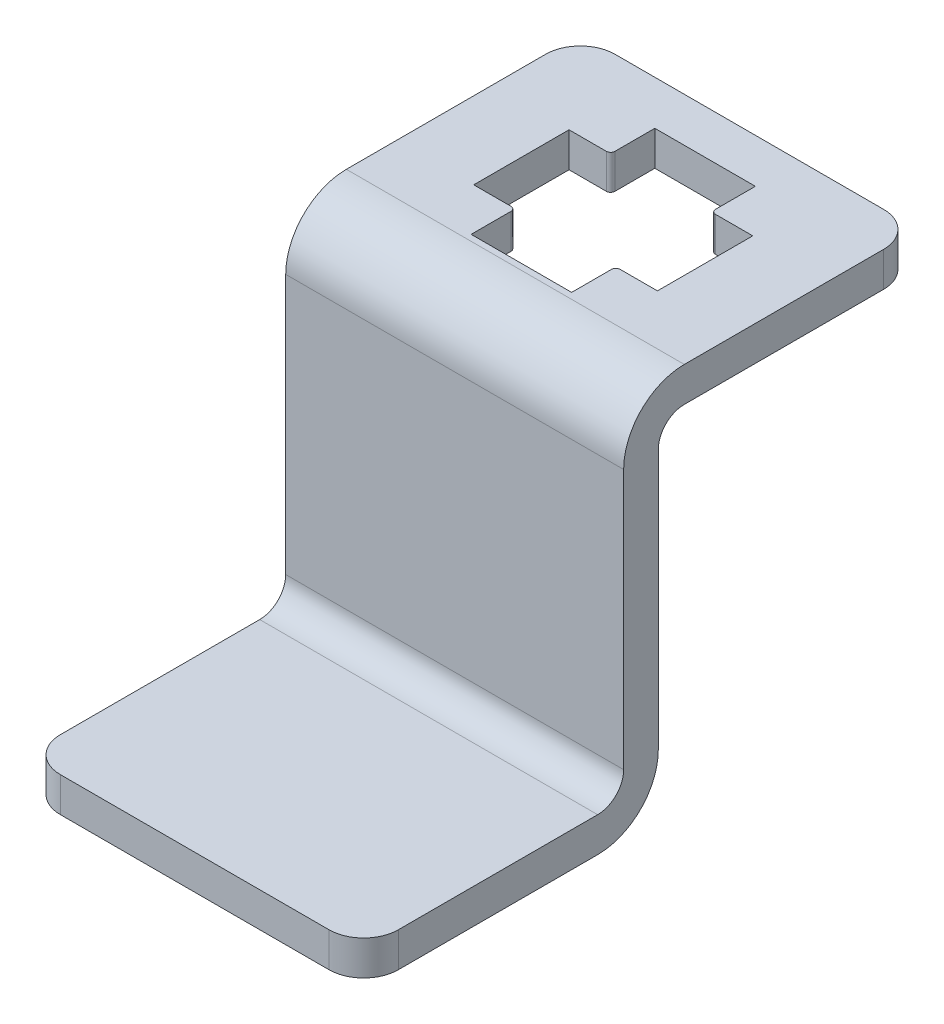
ISO-10303-21;
HEADER;
FILE_DESCRIPTION(('STEP AP214'),'2;1');
FILE_NAME('part.step','',(''),(''),'','','');
FILE_SCHEMA(('AUTOMOTIVE_DESIGN { 1 0 10303 214 1 1 1 1 }'));
ENDSEC;
DATA;
#1=APPLICATION_CONTEXT('core data for automotive mechanical design processes');
#2=APPLICATION_PROTOCOL_DEFINITION('international standard','automotive_design',2000,#1);
#3=PRODUCT_CONTEXT('',#1,'mechanical');
#4=PRODUCT('Part','Part','',(#3));
#5=PRODUCT_RELATED_PRODUCT_CATEGORY('part','',(#4));
#6=PRODUCT_DEFINITION_FORMATION('','',#4);
#7=PRODUCT_DEFINITION_CONTEXT('part definition',#1,'design');
#8=PRODUCT_DEFINITION('design','',#6,#7);
#9=PRODUCT_DEFINITION_SHAPE('','',#8);
#10=(LENGTH_UNIT() NAMED_UNIT(*) SI_UNIT(.MILLI.,.METRE.));
#11=(NAMED_UNIT(*) PLANE_ANGLE_UNIT() SI_UNIT($,.RADIAN.));
#12=(NAMED_UNIT(*) SI_UNIT($,.STERADIAN.) SOLID_ANGLE_UNIT());
#13=UNCERTAINTY_MEASURE_WITH_UNIT(LENGTH_MEASURE(1.E-05),#10,'distance_accuracy_value','');
#14=(GEOMETRIC_REPRESENTATION_CONTEXT(3) GLOBAL_UNCERTAINTY_ASSIGNED_CONTEXT((#13)) GLOBAL_UNIT_ASSIGNED_CONTEXT((#10,
#11,#12)) REPRESENTATION_CONTEXT('',''));
#15=CARTESIAN_POINT('',(0.,0.,0.));
#16=DIRECTION('',(0.,0.,1.));
#17=DIRECTION('',(1.,0.,0.));
#18=AXIS2_PLACEMENT_3D('',#15,#16,#17);
#19=CARTESIAN_POINT('',(9.75,18.,-18.5));
#20=DIRECTION('',(0.,1.,0.));
#21=DIRECTION('',(0.,0.,1.));
#22=AXIS2_PLACEMENT_3D('',#19,#20,#21);
#23=PLANE('',#22);
#24=DIRECTION('',(0.,0.,-1.));
#25=VECTOR('',#24,1.);
#26=CARTESIAN_POINT('',(-2.9,18.,-29.45));
#27=LINE('',#26,#25);
#28=CARTESIAN_POINT('',(-2.9,18.,-27.15));
#29=VERTEX_POINT('',#28);
#30=CARTESIAN_POINT('',(-2.9,18.,-29.45));
#31=VERTEX_POINT('',#30);
#32=EDGE_CURVE('E821',#29,#31,#27,.T.);
#33=ORIENTED_EDGE('',*,*,#32,.F.);
#34=CARTESIAN_POINT('',(-3.15,18.,-27.15));
#35=DIRECTION('',(0.,1.,0.));
#36=DIRECTION('',(0.,0.,1.));
#37=AXIS2_PLACEMENT_3D('',#34,#35,#36);
#38=CIRCLE('',#37,0.25);
#39=CARTESIAN_POINT('',(-3.15,18.,-26.9));
#40=VERTEX_POINT('',#39);
#41=EDGE_CURVE('E342',#40,#29,#38,.T.);
#42=ORIENTED_EDGE('',*,*,#41,.F.);
#43=DIRECTION('',(1.,0.,0.));
#44=VECTOR('',#43,1.);
#45=CARTESIAN_POINT('',(-3.15,18.,-26.9));
#46=LINE('',#45,#44);
#47=CARTESIAN_POINT('',(-5.3,18.,-26.9));
#48=VERTEX_POINT('',#47);
#49=EDGE_CURVE('E339',#48,#40,#46,.T.);
#50=ORIENTED_EDGE('',*,*,#49,.F.);
#51=DIRECTION('',(0.,0.,-1.));
#52=VECTOR('',#51,1.);
#53=CARTESIAN_POINT('',(-5.3,18.,-26.9));
#54=LINE('',#53,#52);
#55=CARTESIAN_POINT('',(-5.3,18.,-21.4));
#56=VERTEX_POINT('',#55);
#57=EDGE_CURVE('E251',#56,#48,#54,.T.);
#58=ORIENTED_EDGE('',*,*,#57,.F.);
#59=DIRECTION('',(1.,0.,0.));
#60=VECTOR('',#59,1.);
#61=CARTESIAN_POINT('',(-3.15,18.,-21.4));
#62=LINE('',#61,#60);
#63=CARTESIAN_POINT('',(-3.15,18.,-21.4));
#64=VERTEX_POINT('',#63);
#65=EDGE_CURVE('E869',#56,#64,#62,.T.);
#66=ORIENTED_EDGE('',*,*,#65,.T.);
#67=CARTESIAN_POINT('',(-3.15,18.,-21.15));
#68=DIRECTION('',(0.,1.,0.));
#69=DIRECTION('',(0.,0.,1.));
#70=AXIS2_PLACEMENT_3D('',#67,#68,#69);
#71=CIRCLE('',#70,0.25);
#72=CARTESIAN_POINT('',(-2.9,18.,-21.15));
#73=VERTEX_POINT('',#72);
#74=EDGE_CURVE('E867',#73,#64,#71,.T.);
#75=ORIENTED_EDGE('',*,*,#74,.F.);
#76=DIRECTION('',(0.,0.,1.));
#77=VECTOR('',#76,1.);
#78=CARTESIAN_POINT('',(-2.89999999999999,18.,-18.85));
#79=LINE('',#78,#77);
#80=CARTESIAN_POINT('',(-2.89999999999999,18.,-18.85));
#81=VERTEX_POINT('',#80);
#82=EDGE_CURVE('E864',#73,#81,#79,.T.);
#83=ORIENTED_EDGE('',*,*,#82,.T.);
#84=DIRECTION('',(-1.,0.,0.));
#85=VECTOR('',#84,1.);
#86=CARTESIAN_POINT('',(-2.89999999999999,18.,-18.85));
#87=LINE('',#86,#85);
#88=CARTESIAN_POINT('',(2.9,18.,-18.85));
#89=VERTEX_POINT('',#88);
#90=EDGE_CURVE('E875',#89,#81,#87,.T.);
#91=ORIENTED_EDGE('',*,*,#90,.F.);
#92=DIRECTION('',(0.,0.,1.));
#93=VECTOR('',#92,1.);
#94=CARTESIAN_POINT('',(2.9,18.,-18.85));
#95=LINE('',#94,#93);
#96=CARTESIAN_POINT('',(2.90000000000001,18.,-21.15));
#97=VERTEX_POINT('',#96);
#98=EDGE_CURVE('E858',#97,#89,#95,.T.);
#99=ORIENTED_EDGE('',*,*,#98,.F.);
#100=CARTESIAN_POINT('',(3.15000000000001,18.,-21.15));
#101=DIRECTION('',(0.,1.,0.));
#102=DIRECTION('',(0.,0.,1.));
#103=AXIS2_PLACEMENT_3D('',#100,#101,#102);
#104=CIRCLE('',#103,0.25);
#105=CARTESIAN_POINT('',(3.15000000000001,18.,-21.4));
#106=VERTEX_POINT('',#105);
#107=EDGE_CURVE('E855',#106,#97,#104,.T.);
#108=ORIENTED_EDGE('',*,*,#107,.F.);
#109=DIRECTION('',(-1.,0.,0.));
#110=VECTOR('',#109,1.);
#111=CARTESIAN_POINT('',(3.15,18.,-21.4));
#112=LINE('',#111,#110);
#113=CARTESIAN_POINT('',(5.3,18.,-21.4));
#114=VERTEX_POINT('',#113);
#115=EDGE_CURVE('E879',#114,#106,#112,.T.);
#116=ORIENTED_EDGE('',*,*,#115,.F.);
#117=DIRECTION('',(0.,0.,-1.));
#118=VECTOR('',#117,1.);
#119=CARTESIAN_POINT('',(5.30000000000001,18.,-26.9));
#120=LINE('',#119,#118);
#121=CARTESIAN_POINT('',(5.30000000000001,18.,-26.9));
#122=VERTEX_POINT('',#121);
#123=EDGE_CURVE('E847',#114,#122,#120,.T.);
#124=ORIENTED_EDGE('',*,*,#123,.T.);
#125=DIRECTION('',(-1.,0.,0.));
#126=VECTOR('',#125,1.);
#127=CARTESIAN_POINT('',(3.15000000000001,18.,-26.9));
#128=LINE('',#127,#126);
#129=CARTESIAN_POINT('',(3.15000000000001,18.,-26.9));
#130=VERTEX_POINT('',#129);
#131=EDGE_CURVE('E844',#122,#130,#128,.T.);
#132=ORIENTED_EDGE('',*,*,#131,.T.);
#133=CARTESIAN_POINT('',(3.15000000000001,18.,-27.15));
#134=DIRECTION('',(0.,1.,0.));
#135=DIRECTION('',(0.,0.,1.));
#136=AXIS2_PLACEMENT_3D('',#133,#134,#135);
#137=CIRCLE('',#136,0.25);
#138=CARTESIAN_POINT('',(2.90000000000001,18.,-27.15));
#139=VERTEX_POINT('',#138);
#140=EDGE_CURVE('E883',#139,#130,#137,.T.);
#141=ORIENTED_EDGE('',*,*,#140,.F.);
#142=DIRECTION('',(0.,0.,-1.));
#143=VECTOR('',#142,1.);
#144=CARTESIAN_POINT('',(2.9,18.,-29.45));
#145=LINE('',#144,#143);
#146=CARTESIAN_POINT('',(2.9,18.,-29.45));
#147=VERTEX_POINT('',#146);
#148=EDGE_CURVE('E829',#139,#147,#145,.T.);
#149=ORIENTED_EDGE('',*,*,#148,.T.);
#150=DIRECTION('',(-1.,0.,0.));
#151=VECTOR('',#150,1.);
#152=CARTESIAN_POINT('',(-2.9,18.,-29.45));
#153=LINE('',#152,#151);
#154=EDGE_CURVE('E827',#147,#31,#153,.T.);
#155=ORIENTED_EDGE('',*,*,#154,.T.);
#156=EDGE_LOOP('',(#33,#42,#50,#58,#66,#75,#83,#91,#99,#108,#116,#124,#132,#141,#149,#155));
#157=FACE_BOUND('',#156,.T.);
#158=DIRECTION('',(-1.,0.,0.));
#159=VECTOR('',#158,1.);
#160=CARTESIAN_POINT('',(9.75,18.,-32.));
#161=LINE('',#160,#159);
#162=CARTESIAN_POINT('',(7.75,18.,-32.));
#163=VERTEX_POINT('',#162);
#164=CARTESIAN_POINT('',(-7.75,18.,-32.));
#165=VERTEX_POINT('',#164);
#166=EDGE_CURVE('E421',#163,#165,#161,.T.);
#167=ORIENTED_EDGE('',*,*,#166,.F.);
#168=CARTESIAN_POINT('',(7.75,18.,-30.));
#169=DIRECTION('',(0.,1.,0.));
#170=DIRECTION('',(0.,0.,1.));
#171=AXIS2_PLACEMENT_3D('',#168,#169,#170);
#172=CIRCLE('',#171,2.);
#173=CARTESIAN_POINT('',(9.75,18.,-30.));
#174=VERTEX_POINT('',#173);
#175=EDGE_CURVE('E56',#163,#174,#172,.F.);
#176=ORIENTED_EDGE('',*,*,#175,.T.);
#177=DIRECTION('',(0.,0.,-1.));
#178=VECTOR('',#177,1.);
#179=CARTESIAN_POINT('',(9.75,18.,-18.5));
#180=LINE('',#179,#178);
#181=CARTESIAN_POINT('',(9.75,18.,-18.5));
#182=VERTEX_POINT('',#181);
#183=EDGE_CURVE('E343',#182,#174,#180,.T.);
#184=ORIENTED_EDGE('',*,*,#183,.F.);
#185=DIRECTION('',(-1.,0.,0.));
#186=VECTOR('',#185,1.);
#187=CARTESIAN_POINT('',(9.75,18.,-18.5));
#188=LINE('',#187,#186);
#189=CARTESIAN_POINT('',(-9.75,18.,-18.5));
#190=VERTEX_POINT('',#189);
#191=EDGE_CURVE('E369',#182,#190,#188,.T.);
#192=ORIENTED_EDGE('',*,*,#191,.T.);
#193=DIRECTION('',(0.,0.,-1.));
#194=VECTOR('',#193,1.);
#195=CARTESIAN_POINT('',(-9.75,18.,-18.5));
#196=LINE('',#195,#194);
#197=CARTESIAN_POINT('',(-9.75,18.,-30.));
#198=VERTEX_POINT('',#197);
#199=EDGE_CURVE('E341',#190,#198,#196,.T.);
#200=ORIENTED_EDGE('',*,*,#199,.T.);
#201=CARTESIAN_POINT('',(-7.75,18.,-30.));
#202=DIRECTION('',(0.,1.,0.));
#203=DIRECTION('',(0.,0.,1.));
#204=AXIS2_PLACEMENT_3D('',#201,#202,#203);
#205=CIRCLE('',#204,2.);
#206=EDGE_CURVE('E48',#198,#165,#205,.F.);
#207=ORIENTED_EDGE('',*,*,#206,.T.);
#208=EDGE_LOOP('',(#167,#176,#184,#192,#200,#207));
#209=FACE_BOUND('',#208,.T.);
#210=ADVANCED_FACE('F33',(#157,#209),#23,.F.);
#211=CARTESIAN_POINT('',(9.75,20.,-32.));
#212=DIRECTION('',(0.,0.,-1.));
#213=DIRECTION('',(-1.,0.,0.));
#214=AXIS2_PLACEMENT_3D('',#211,#212,#213);
#215=PLANE('',#214);
#216=DIRECTION('',(-1.,0.,0.));
#217=VECTOR('',#216,1.);
#218=CARTESIAN_POINT('',(9.75,20.,-32.));
#219=LINE('',#218,#217);
#220=CARTESIAN_POINT('',(7.75,20.,-32.));
#221=VERTEX_POINT('',#220);
#222=CARTESIAN_POINT('',(-7.75,20.,-32.));
#223=VERTEX_POINT('',#222);
#224=EDGE_CURVE('E418',#221,#223,#219,.T.);
#225=ORIENTED_EDGE('',*,*,#224,.F.);
#226=DIRECTION('',(0.,-1.,0.));
#227=VECTOR('',#226,1.);
#228=CARTESIAN_POINT('',(7.75,18.,-32.));
#229=LINE('',#228,#227);
#230=EDGE_CURVE('E448',#221,#163,#229,.T.);
#231=ORIENTED_EDGE('',*,*,#230,.T.);
#232=ORIENTED_EDGE('',*,*,#166,.T.);
#233=DIRECTION('',(0.,-1.,0.));
#234=VECTOR('',#233,1.);
#235=CARTESIAN_POINT('',(-7.75,20.,-32.));
#236=LINE('',#235,#234);
#237=EDGE_CURVE('E446',#165,#223,#236,.F.);
#238=ORIENTED_EDGE('',*,*,#237,.T.);
#239=EDGE_LOOP('',(#225,#231,#232,#238));
#240=FACE_BOUND('',#239,.T.);
#241=ADVANCED_FACE('F463',(#240),#215,.T.);
#242=CARTESIAN_POINT('',(9.75,20.,-18.5));
#243=DIRECTION('',(0.,1.,0.));
#244=DIRECTION('',(0.,0.,1.));
#245=AXIS2_PLACEMENT_3D('',#242,#243,#244);
#246=PLANE('',#245);
#247=CARTESIAN_POINT('',(-3.15,20.,-27.15));
#248=DIRECTION('',(0.,-1.,0.));
#249=DIRECTION('',(0.,0.,-1.));
#250=AXIS2_PLACEMENT_3D('',#247,#248,#249);
#251=CIRCLE('',#250,0.25);
#252=CARTESIAN_POINT('',(-2.9,20.,-27.15));
#253=VERTEX_POINT('',#252);
#254=CARTESIAN_POINT('',(-3.15,20.,-26.9));
#255=VERTEX_POINT('',#254);
#256=EDGE_CURVE('E264',#253,#255,#251,.T.);
#257=ORIENTED_EDGE('',*,*,#256,.F.);
#258=DIRECTION('',(0.,0.,1.));
#259=VECTOR('',#258,1.);
#260=CARTESIAN_POINT('',(-2.9,20.,-29.45));
#261=LINE('',#260,#259);
#262=CARTESIAN_POINT('',(-2.9,20.,-29.45));
#263=VERTEX_POINT('',#262);
#264=EDGE_CURVE('E308',#263,#253,#261,.T.);
#265=ORIENTED_EDGE('',*,*,#264,.F.);
#266=DIRECTION('',(1.,0.,0.));
#267=VECTOR('',#266,1.);
#268=CARTESIAN_POINT('',(-2.9,20.,-29.45));
#269=LINE('',#268,#267);
#270=CARTESIAN_POINT('',(2.9,20.,-29.45));
#271=VERTEX_POINT('',#270);
#272=EDGE_CURVE('E305',#263,#271,#269,.T.);
#273=ORIENTED_EDGE('',*,*,#272,.T.);
#274=DIRECTION('',(0.,0.,1.));
#275=VECTOR('',#274,1.);
#276=CARTESIAN_POINT('',(2.9,20.,-29.45));
#277=LINE('',#276,#275);
#278=CARTESIAN_POINT('',(2.90000000000001,20.,-27.15));
#279=VERTEX_POINT('',#278);
#280=EDGE_CURVE('E302',#271,#279,#277,.T.);
#281=ORIENTED_EDGE('',*,*,#280,.T.);
#282=CARTESIAN_POINT('',(3.15000000000001,20.,-27.15));
#283=DIRECTION('',(0.,-1.,0.));
#284=DIRECTION('',(0.,0.,-1.));
#285=AXIS2_PLACEMENT_3D('',#282,#283,#284);
#286=CIRCLE('',#285,0.25);
#287=CARTESIAN_POINT('',(3.15000000000001,20.,-26.9));
#288=VERTEX_POINT('',#287);
#289=EDGE_CURVE('E299',#288,#279,#286,.T.);
#290=ORIENTED_EDGE('',*,*,#289,.F.);
#291=DIRECTION('',(1.,0.,0.));
#292=VECTOR('',#291,1.);
#293=CARTESIAN_POINT('',(3.15000000000001,20.,-26.9));
#294=LINE('',#293,#292);
#295=CARTESIAN_POINT('',(5.30000000000001,20.,-26.9));
#296=VERTEX_POINT('',#295);
#297=EDGE_CURVE('E296',#288,#296,#294,.T.);
#298=ORIENTED_EDGE('',*,*,#297,.T.);
#299=DIRECTION('',(0.,0.,1.));
#300=VECTOR('',#299,1.);
#301=CARTESIAN_POINT('',(5.30000000000001,20.,-26.9));
#302=LINE('',#301,#300);
#303=CARTESIAN_POINT('',(5.30000000000001,20.,-21.4));
#304=VERTEX_POINT('',#303);
#305=EDGE_CURVE('E293',#296,#304,#302,.T.);
#306=ORIENTED_EDGE('',*,*,#305,.T.);
#307=DIRECTION('',(1.,0.,0.));
#308=VECTOR('',#307,1.);
#309=CARTESIAN_POINT('',(3.15,20.,-21.4));
#310=LINE('',#309,#308);
#311=CARTESIAN_POINT('',(3.15000000000001,20.,-21.4));
#312=VERTEX_POINT('',#311);
#313=EDGE_CURVE('E290',#312,#304,#310,.T.);
#314=ORIENTED_EDGE('',*,*,#313,.F.);
#315=CARTESIAN_POINT('',(3.15000000000001,20.,-21.15));
#316=DIRECTION('',(0.,-1.,0.));
#317=DIRECTION('',(0.,0.,-1.));
#318=AXIS2_PLACEMENT_3D('',#315,#316,#317);
#319=CIRCLE('',#318,0.25);
#320=CARTESIAN_POINT('',(2.90000000000001,20.,-21.15));
#321=VERTEX_POINT('',#320);
#322=EDGE_CURVE('E287',#321,#312,#319,.T.);
#323=ORIENTED_EDGE('',*,*,#322,.F.);
#324=DIRECTION('',(0.,0.,-1.));
#325=VECTOR('',#324,1.);
#326=CARTESIAN_POINT('',(2.9,20.,-18.85));
#327=LINE('',#326,#325);
#328=CARTESIAN_POINT('',(2.9,20.,-18.85));
#329=VERTEX_POINT('',#328);
#330=EDGE_CURVE('E284',#329,#321,#327,.T.);
#331=ORIENTED_EDGE('',*,*,#330,.F.);
#332=DIRECTION('',(1.,0.,0.));
#333=VECTOR('',#332,1.);
#334=CARTESIAN_POINT('',(-2.89999999999999,20.,-18.85));
#335=LINE('',#334,#333);
#336=CARTESIAN_POINT('',(-2.89999999999999,20.,-18.85));
#337=VERTEX_POINT('',#336);
#338=EDGE_CURVE('E281',#337,#329,#335,.T.);
#339=ORIENTED_EDGE('',*,*,#338,.F.);
#340=DIRECTION('',(0.,0.,-1.));
#341=VECTOR('',#340,1.);
#342=CARTESIAN_POINT('',(-2.89999999999999,20.,-18.85));
#343=LINE('',#342,#341);
#344=CARTESIAN_POINT('',(-2.9,20.,-21.15));
#345=VERTEX_POINT('',#344);
#346=EDGE_CURVE('E278',#337,#345,#343,.T.);
#347=ORIENTED_EDGE('',*,*,#346,.T.);
#348=CARTESIAN_POINT('',(-3.15,20.,-21.15));
#349=DIRECTION('',(0.,-1.,0.));
#350=DIRECTION('',(0.,0.,-1.));
#351=AXIS2_PLACEMENT_3D('',#348,#349,#350);
#352=CIRCLE('',#351,0.25);
#353=CARTESIAN_POINT('',(-3.15,20.,-21.4));
#354=VERTEX_POINT('',#353);
#355=EDGE_CURVE('E272',#354,#345,#352,.T.);
#356=ORIENTED_EDGE('',*,*,#355,.F.);
#357=DIRECTION('',(-1.,0.,0.));
#358=VECTOR('',#357,1.);
#359=CARTESIAN_POINT('',(-3.15,20.,-21.4));
#360=LINE('',#359,#358);
#361=CARTESIAN_POINT('',(-5.3,20.,-21.4));
#362=VERTEX_POINT('',#361);
#363=EDGE_CURVE('E270',#354,#362,#360,.T.);
#364=ORIENTED_EDGE('',*,*,#363,.T.);
#365=DIRECTION('',(0.,0.,1.));
#366=VECTOR('',#365,1.);
#367=CARTESIAN_POINT('',(-5.3,20.,-26.9));
#368=LINE('',#367,#366);
#369=CARTESIAN_POINT('',(-5.3,20.,-26.9));
#370=VERTEX_POINT('',#369);
#371=EDGE_CURVE('E248',#370,#362,#368,.T.);
#372=ORIENTED_EDGE('',*,*,#371,.F.);
#373=DIRECTION('',(-1.,0.,0.));
#374=VECTOR('',#373,1.);
#375=CARTESIAN_POINT('',(-3.15,20.,-26.9));
#376=LINE('',#375,#374);
#377=EDGE_CURVE('E259',#255,#370,#376,.T.);
#378=ORIENTED_EDGE('',*,*,#377,.F.);
#379=EDGE_LOOP('',(#257,#265,#273,#281,#290,#298,#306,#314,#323,#331,#339,#347,#356,#364,#372,#378));
#380=FACE_BOUND('',#379,.T.);
#381=DIRECTION('',(0.,0.,-1.));
#382=VECTOR('',#381,1.);
#383=CARTESIAN_POINT('',(9.75,20.,-18.5));
#384=LINE('',#383,#382);
#385=CARTESIAN_POINT('',(9.75,20.,-18.5));
#386=VERTEX_POINT('',#385);
#387=CARTESIAN_POINT('',(9.75,20.,-30.));
#388=VERTEX_POINT('',#387);
#389=EDGE_CURVE('E346',#386,#388,#384,.T.);
#390=ORIENTED_EDGE('',*,*,#389,.T.);
#391=CARTESIAN_POINT('',(7.75,20.,-30.));
#392=DIRECTION('',(0.,1.,0.));
#393=DIRECTION('',(0.,0.,1.));
#394=AXIS2_PLACEMENT_3D('',#391,#392,#393);
#395=CIRCLE('',#394,2.);
#396=EDGE_CURVE('E11',#388,#221,#395,.T.);
#397=ORIENTED_EDGE('',*,*,#396,.T.);
#398=ORIENTED_EDGE('',*,*,#224,.T.);
#399=CARTESIAN_POINT('',(-7.75,20.,-30.));
#400=DIRECTION('',(0.,1.,0.));
#401=DIRECTION('',(0.,0.,1.));
#402=AXIS2_PLACEMENT_3D('',#399,#400,#401);
#403=CIRCLE('',#402,2.);
#404=CARTESIAN_POINT('',(-9.75,20.,-30.));
#405=VERTEX_POINT('',#404);
#406=EDGE_CURVE('E41',#223,#405,#403,.T.);
#407=ORIENTED_EDGE('',*,*,#406,.T.);
#408=DIRECTION('',(0.,0.,-1.));
#409=VECTOR('',#408,1.);
#410=CARTESIAN_POINT('',(-9.75,20.,-18.5));
#411=LINE('',#410,#409);
#412=CARTESIAN_POINT('',(-9.75,20.,-18.5));
#413=VERTEX_POINT('',#412);
#414=EDGE_CURVE('E371',#413,#405,#411,.T.);
#415=ORIENTED_EDGE('',*,*,#414,.F.);
#416=DIRECTION('',(-1.,0.,0.));
#417=VECTOR('',#416,1.);
#418=CARTESIAN_POINT('',(9.75,20.,-18.5));
#419=LINE('',#418,#417);
#420=EDGE_CURVE('E416',#386,#413,#419,.T.);
#421=ORIENTED_EDGE('',*,*,#420,.F.);
#422=EDGE_LOOP('',(#390,#397,#398,#407,#415,#421));
#423=FACE_BOUND('',#422,.T.);
#424=ADVANCED_FACE('F266',(#380,#423),#246,.T.);
#425=CARTESIAN_POINT('',(9.75,16.5,-18.5));
#426=DIRECTION('',(-1.,0.,0.));
#427=DIRECTION('',(0.,0.,1.));
#428=AXIS2_PLACEMENT_3D('',#425,#426,#427);
#429=CYLINDRICAL_SURFACE('',#428,3.5);
#430=CARTESIAN_POINT('',(-9.75,16.5,-18.5));
#431=DIRECTION('',(-1.,0.,0.));
#432=DIRECTION('',(0.,0.,1.));
#433=AXIS2_PLACEMENT_3D('',#430,#431,#432);
#434=CIRCLE('',#433,3.5);
#435=CARTESIAN_POINT('',(-9.75,16.5,-15.));
#436=VERTEX_POINT('',#435);
#437=EDGE_CURVE('E374',#436,#413,#434,.T.);
#438=ORIENTED_EDGE('',*,*,#437,.F.);
#439=DIRECTION('',(-1.,0.,0.));
#440=VECTOR('',#439,1.);
#441=CARTESIAN_POINT('',(9.75,16.5,-15.));
#442=LINE('',#441,#440);
#443=CARTESIAN_POINT('',(9.75,16.5,-15.));
#444=VERTEX_POINT('',#443);
#445=EDGE_CURVE('E414',#444,#436,#442,.T.);
#446=ORIENTED_EDGE('',*,*,#445,.F.);
#447=CARTESIAN_POINT('',(9.75,16.5,-18.5));
#448=DIRECTION('',(-1.,0.,0.));
#449=DIRECTION('',(0.,0.,1.));
#450=AXIS2_PLACEMENT_3D('',#447,#448,#449);
#451=CIRCLE('',#450,3.5);
#452=EDGE_CURVE('E350',#444,#386,#451,.T.);
#453=ORIENTED_EDGE('',*,*,#452,.T.);
#454=ORIENTED_EDGE('',*,*,#420,.T.);
#455=EDGE_LOOP('',(#438,#446,#453,#454));
#456=FACE_BOUND('',#455,.T.);
#457=ADVANCED_FACE('F476',(#456),#429,.T.);
#458=CARTESIAN_POINT('',(9.75,1.5,-15.));
#459=DIRECTION('',(0.,0.,1.));
#460=DIRECTION('',(1.,0.,0.));
#461=AXIS2_PLACEMENT_3D('',#458,#459,#460);
#462=PLANE('',#461);
#463=DIRECTION('',(0.,1.,0.));
#464=VECTOR('',#463,1.);
#465=CARTESIAN_POINT('',(-9.75,1.5,-15.));
#466=LINE('',#465,#464);
#467=CARTESIAN_POINT('',(-9.75,1.5,-15.));
#468=VERTEX_POINT('',#467);
#469=EDGE_CURVE('E377',#468,#436,#466,.T.);
#470=ORIENTED_EDGE('',*,*,#469,.F.);
#471=DIRECTION('',(-1.,0.,0.));
#472=VECTOR('',#471,1.);
#473=CARTESIAN_POINT('',(9.75,1.5,-15.));
#474=LINE('',#473,#472);
#475=CARTESIAN_POINT('',(9.75,1.5,-15.));
#476=VERTEX_POINT('',#475);
#477=EDGE_CURVE('E412',#476,#468,#474,.T.);
#478=ORIENTED_EDGE('',*,*,#477,.F.);
#479=DIRECTION('',(0.,1.,0.));
#480=VECTOR('',#479,1.);
#481=CARTESIAN_POINT('',(9.75,1.5,-15.));
#482=LINE('',#481,#480);
#483=EDGE_CURVE('E353',#476,#444,#482,.T.);
#484=ORIENTED_EDGE('',*,*,#483,.T.);
#485=ORIENTED_EDGE('',*,*,#445,.T.);
#486=EDGE_LOOP('',(#470,#478,#484,#485));
#487=FACE_BOUND('',#486,.T.);
#488=ADVANCED_FACE('F479',(#487),#462,.T.);
#489=CARTESIAN_POINT('',(9.75,1.5,-13.5));
#490=DIRECTION('',(-1.,0.,0.));
#491=DIRECTION('',(0.,0.,1.));
#492=AXIS2_PLACEMENT_3D('',#489,#490,#491);
#493=CYLINDRICAL_SURFACE('',#492,1.5);
#494=CARTESIAN_POINT('',(-9.75,1.5,-13.5));
#495=DIRECTION('',(1.,0.,0.));
#496=DIRECTION('',(0.,0.,-1.));
#497=AXIS2_PLACEMENT_3D('',#494,#495,#496);
#498=CIRCLE('',#497,1.5);
#499=CARTESIAN_POINT('',(-9.75,0.,-13.5));
#500=VERTEX_POINT('',#499);
#501=EDGE_CURVE('E380',#500,#468,#498,.T.);
#502=ORIENTED_EDGE('',*,*,#501,.F.);
#503=DIRECTION('',(-1.,0.,0.));
#504=VECTOR('',#503,1.);
#505=CARTESIAN_POINT('',(9.75,0.,-13.5));
#506=LINE('',#505,#504);
#507=CARTESIAN_POINT('',(9.75,0.,-13.5));
#508=VERTEX_POINT('',#507);
#509=EDGE_CURVE('E409',#508,#500,#506,.T.);
#510=ORIENTED_EDGE('',*,*,#509,.F.);
#511=CARTESIAN_POINT('',(9.75,1.5,-13.5));
#512=DIRECTION('',(1.,0.,0.));
#513=DIRECTION('',(0.,0.,-1.));
#514=AXIS2_PLACEMENT_3D('',#511,#512,#513);
#515=CIRCLE('',#514,1.5);
#516=EDGE_CURVE('E356',#508,#476,#515,.T.);
#517=ORIENTED_EDGE('',*,*,#516,.T.);
#518=ORIENTED_EDGE('',*,*,#477,.T.);
#519=EDGE_LOOP('',(#502,#510,#517,#518));
#520=FACE_BOUND('',#519,.T.);
#521=ADVANCED_FACE('F484',(#520),#493,.F.);
#522=CARTESIAN_POINT('',(9.75,0.,0.));
#523=DIRECTION('',(0.,1.,0.));
#524=DIRECTION('',(0.,0.,1.));
#525=AXIS2_PLACEMENT_3D('',#522,#523,#524);
#526=PLANE('',#525);
#527=DIRECTION('',(0.,0.,-1.));
#528=VECTOR('',#527,1.);
#529=CARTESIAN_POINT('',(-9.75,0.,0.));
#530=LINE('',#529,#528);
#531=CARTESIAN_POINT('',(-9.75,0.,-2.));
#532=VERTEX_POINT('',#531);
#533=EDGE_CURVE('E383',#532,#500,#530,.T.);
#534=ORIENTED_EDGE('',*,*,#533,.F.);
#535=CARTESIAN_POINT('',(-7.75,0.,-2.));
#536=DIRECTION('',(0.,1.,0.));
#537=DIRECTION('',(0.,0.,1.));
#538=AXIS2_PLACEMENT_3D('',#535,#536,#537);
#539=CIRCLE('',#538,2.);
#540=CARTESIAN_POINT('',(-7.75,0.,0.));
#541=VERTEX_POINT('',#540);
#542=EDGE_CURVE('E431',#532,#541,#539,.T.);
#543=ORIENTED_EDGE('',*,*,#542,.T.);
#544=DIRECTION('',(-1.,0.,0.));
#545=VECTOR('',#544,1.);
#546=CARTESIAN_POINT('',(9.75,0.,0.));
#547=LINE('',#546,#545);
#548=CARTESIAN_POINT('',(7.75,0.,0.));
#549=VERTEX_POINT('',#548);
#550=EDGE_CURVE('E406',#549,#541,#547,.T.);
#551=ORIENTED_EDGE('',*,*,#550,.F.);
#552=CARTESIAN_POINT('',(7.75,0.,-2.));
#553=DIRECTION('',(0.,1.,0.));
#554=DIRECTION('',(0.,0.,1.));
#555=AXIS2_PLACEMENT_3D('',#552,#553,#554);
#556=CIRCLE('',#555,2.);
#557=CARTESIAN_POINT('',(9.75,0.,-2.));
#558=VERTEX_POINT('',#557);
#559=EDGE_CURVE('E429',#549,#558,#556,.T.);
#560=ORIENTED_EDGE('',*,*,#559,.T.);
#561=DIRECTION('',(0.,0.,-1.));
#562=VECTOR('',#561,1.);
#563=CARTESIAN_POINT('',(9.75,0.,0.));
#564=LINE('',#563,#562);
#565=EDGE_CURVE('E359',#558,#508,#564,.T.);
#566=ORIENTED_EDGE('',*,*,#565,.T.);
#567=ORIENTED_EDGE('',*,*,#509,.T.);
#568=EDGE_LOOP('',(#534,#543,#551,#560,#566,#567));
#569=FACE_BOUND('',#568,.T.);
#570=ADVANCED_FACE('F487',(#569),#526,.T.);
#571=CARTESIAN_POINT('',(9.75,-2.,0.));
#572=DIRECTION('',(0.,0.,1.));
#573=DIRECTION('',(1.,0.,0.));
#574=AXIS2_PLACEMENT_3D('',#571,#572,#573);
#575=PLANE('',#574);
#576=ORIENTED_EDGE('',*,*,#550,.T.);
#577=DIRECTION('',(0.,1.,0.));
#578=VECTOR('',#577,1.);
#579=CARTESIAN_POINT('',(-7.75,-2.,0.));
#580=LINE('',#579,#578);
#581=CARTESIAN_POINT('',(-7.75,-2.,0.));
#582=VERTEX_POINT('',#581);
#583=EDGE_CURVE('E436',#541,#582,#580,.F.);
#584=ORIENTED_EDGE('',*,*,#583,.T.);
#585=DIRECTION('',(-1.,0.,0.));
#586=VECTOR('',#585,1.);
#587=CARTESIAN_POINT('',(9.75,-2.,0.));
#588=LINE('',#587,#586);
#589=CARTESIAN_POINT('',(7.75,-2.,0.));
#590=VERTEX_POINT('',#589);
#591=EDGE_CURVE('E403',#590,#582,#588,.T.);
#592=ORIENTED_EDGE('',*,*,#591,.F.);
#593=DIRECTION('',(0.,1.,0.));
#594=VECTOR('',#593,1.);
#595=CARTESIAN_POINT('',(7.75,0.,0.));
#596=LINE('',#595,#594);
#597=EDGE_CURVE('E433',#590,#549,#596,.T.);
#598=ORIENTED_EDGE('',*,*,#597,.T.);
#599=EDGE_LOOP('',(#576,#584,#592,#598));
#600=FACE_BOUND('',#599,.T.);
#601=ADVANCED_FACE('F501',(#600),#575,.T.);
#602=CARTESIAN_POINT('',(9.75,-2.,0.));
#603=DIRECTION('',(0.,1.,0.));
#604=DIRECTION('',(0.,0.,1.));
#605=AXIS2_PLACEMENT_3D('',#602,#603,#604);
#606=PLANE('',#605);
#607=ORIENTED_EDGE('',*,*,#591,.T.);
#608=CARTESIAN_POINT('',(-7.75,-2.,-2.));
#609=DIRECTION('',(0.,1.,0.));
#610=DIRECTION('',(0.,0.,1.));
#611=AXIS2_PLACEMENT_3D('',#608,#609,#610);
#612=CIRCLE('',#611,2.);
#613=CARTESIAN_POINT('',(-9.75,-2.,-2.));
#614=VERTEX_POINT('',#613);
#615=EDGE_CURVE('E440',#582,#614,#612,.F.);
#616=ORIENTED_EDGE('',*,*,#615,.T.);
#617=DIRECTION('',(0.,0.,-1.));
#618=VECTOR('',#617,1.);
#619=CARTESIAN_POINT('',(-9.75,-2.,0.));
#620=LINE('',#619,#618);
#621=CARTESIAN_POINT('',(-9.75,-2.,-13.5));
#622=VERTEX_POINT('',#621);
#623=EDGE_CURVE('E385',#614,#622,#620,.T.);
#624=ORIENTED_EDGE('',*,*,#623,.T.);
#625=DIRECTION('',(-1.,0.,0.));
#626=VECTOR('',#625,1.);
#627=CARTESIAN_POINT('',(9.75,-2.,-13.5));
#628=LINE('',#627,#626);
#629=CARTESIAN_POINT('',(9.75,-2.,-13.5));
#630=VERTEX_POINT('',#629);
#631=EDGE_CURVE('E400',#630,#622,#628,.T.);
#632=ORIENTED_EDGE('',*,*,#631,.F.);
#633=DIRECTION('',(0.,0.,-1.));
#634=VECTOR('',#633,1.);
#635=CARTESIAN_POINT('',(9.75,-2.,0.));
#636=LINE('',#635,#634);
#637=CARTESIAN_POINT('',(9.75,-2.,-2.));
#638=VERTEX_POINT('',#637);
#639=EDGE_CURVE('E361',#638,#630,#636,.T.);
#640=ORIENTED_EDGE('',*,*,#639,.F.);
#641=CARTESIAN_POINT('',(7.75,-2.,-2.));
#642=DIRECTION('',(0.,1.,0.));
#643=DIRECTION('',(0.,0.,1.));
#644=AXIS2_PLACEMENT_3D('',#641,#642,#643);
#645=CIRCLE('',#644,2.);
#646=EDGE_CURVE('E438',#638,#590,#645,.F.);
#647=ORIENTED_EDGE('',*,*,#646,.T.);
#648=EDGE_LOOP('',(#607,#616,#624,#632,#640,#647));
#649=FACE_BOUND('',#648,.T.);
#650=ADVANCED_FACE('F497',(#649),#606,.F.);
#651=CARTESIAN_POINT('',(9.75,1.5,-13.5));
#652=DIRECTION('',(-1.,0.,0.));
#653=DIRECTION('',(0.,0.,1.));
#654=AXIS2_PLACEMENT_3D('',#651,#652,#653);
#655=CYLINDRICAL_SURFACE('',#654,3.5);
#656=CARTESIAN_POINT('',(-9.75,1.5,-13.5));
#657=DIRECTION('',(1.,0.,0.));
#658=DIRECTION('',(0.,0.,-1.));
#659=AXIS2_PLACEMENT_3D('',#656,#657,#658);
#660=CIRCLE('',#659,3.5);
#661=CARTESIAN_POINT('',(-9.75,1.5,-17.));
#662=VERTEX_POINT('',#661);
#663=EDGE_CURVE('E387',#622,#662,#660,.T.);
#664=ORIENTED_EDGE('',*,*,#663,.T.);
#665=DIRECTION('',(-1.,0.,0.));
#666=VECTOR('',#665,1.);
#667=CARTESIAN_POINT('',(9.75,1.5,-17.));
#668=LINE('',#667,#666);
#669=CARTESIAN_POINT('',(9.75,1.5,-17.));
#670=VERTEX_POINT('',#669);
#671=EDGE_CURVE('E397',#670,#662,#668,.T.);
#672=ORIENTED_EDGE('',*,*,#671,.F.);
#673=CARTESIAN_POINT('',(9.75,1.5,-13.5));
#674=DIRECTION('',(1.,0.,0.));
#675=DIRECTION('',(0.,0.,-1.));
#676=AXIS2_PLACEMENT_3D('',#673,#674,#675);
#677=CIRCLE('',#676,3.5);
#678=EDGE_CURVE('E363',#630,#670,#677,.T.);
#679=ORIENTED_EDGE('',*,*,#678,.F.);
#680=ORIENTED_EDGE('',*,*,#631,.T.);
#681=EDGE_LOOP('',(#664,#672,#679,#680));
#682=FACE_BOUND('',#681,.T.);
#683=ADVANCED_FACE('F511',(#682),#655,.T.);
#684=CARTESIAN_POINT('',(9.75,1.5,-17.));
#685=DIRECTION('',(0.,0.,1.));
#686=DIRECTION('',(1.,0.,0.));
#687=AXIS2_PLACEMENT_3D('',#684,#685,#686);
#688=PLANE('',#687);
#689=DIRECTION('',(0.,1.,0.));
#690=VECTOR('',#689,1.);
#691=CARTESIAN_POINT('',(-9.75,1.5,-17.));
#692=LINE('',#691,#690);
#693=CARTESIAN_POINT('',(-9.75,16.5,-17.));
#694=VERTEX_POINT('',#693);
#695=EDGE_CURVE('E389',#662,#694,#692,.T.);
#696=ORIENTED_EDGE('',*,*,#695,.T.);
#697=DIRECTION('',(-1.,0.,0.));
#698=VECTOR('',#697,1.);
#699=CARTESIAN_POINT('',(9.75,16.5,-17.));
#700=LINE('',#699,#698);
#701=CARTESIAN_POINT('',(9.75,16.5,-17.));
#702=VERTEX_POINT('',#701);
#703=EDGE_CURVE('E394',#702,#694,#700,.T.);
#704=ORIENTED_EDGE('',*,*,#703,.F.);
#705=DIRECTION('',(0.,1.,0.));
#706=VECTOR('',#705,1.);
#707=CARTESIAN_POINT('',(9.75,1.5,-17.));
#708=LINE('',#707,#706);
#709=EDGE_CURVE('E365',#670,#702,#708,.T.);
#710=ORIENTED_EDGE('',*,*,#709,.F.);
#711=ORIENTED_EDGE('',*,*,#671,.T.);
#712=EDGE_LOOP('',(#696,#704,#710,#711));
#713=FACE_BOUND('',#712,.T.);
#714=ADVANCED_FACE('F515',(#713),#688,.F.);
#715=CARTESIAN_POINT('',(9.75,16.5,-18.5));
#716=DIRECTION('',(-1.,0.,0.));
#717=DIRECTION('',(0.,0.,1.));
#718=AXIS2_PLACEMENT_3D('',#715,#716,#717);
#719=CYLINDRICAL_SURFACE('',#718,1.5);
#720=CARTESIAN_POINT('',(-9.75,16.5,-18.5));
#721=DIRECTION('',(1.,0.,0.));
#722=DIRECTION('',(0.,0.,-1.));
#723=AXIS2_PLACEMENT_3D('',#720,#721,#722);
#724=CIRCLE('',#723,1.5);
#725=EDGE_CURVE('E347',#694,#190,#724,.F.);
#726=ORIENTED_EDGE('',*,*,#725,.T.);
#727=ORIENTED_EDGE('',*,*,#191,.F.);
#728=CARTESIAN_POINT('',(9.75,16.5,-18.5));
#729=DIRECTION('',(1.,0.,0.));
#730=DIRECTION('',(0.,0.,-1.));
#731=AXIS2_PLACEMENT_3D('',#728,#729,#730);
#732=CIRCLE('',#731,1.5);
#733=EDGE_CURVE('E367',#702,#182,#732,.F.);
#734=ORIENTED_EDGE('',*,*,#733,.F.);
#735=ORIENTED_EDGE('',*,*,#703,.T.);
#736=EDGE_LOOP('',(#726,#727,#734,#735));
#737=FACE_BOUND('',#736,.T.);
#738=ADVANCED_FACE('F518',(#737),#719,.F.);
#739=CARTESIAN_POINT('',(9.75,16.5,-18.5));
#740=DIRECTION('',(-1.,0.,0.));
#741=DIRECTION('',(0.,0.,1.));
#742=AXIS2_PLACEMENT_3D('',#739,#740,#741);
#743=PLANE('',#742);
#744=ORIENTED_EDGE('',*,*,#565,.F.);
#745=DIRECTION('',(0.,1.,0.));
#746=VECTOR('',#745,1.);
#747=CARTESIAN_POINT('',(9.75,-2.,-2.));
#748=LINE('',#747,#746);
#749=EDGE_CURVE('E444',#558,#638,#748,.F.);
#750=ORIENTED_EDGE('',*,*,#749,.T.);
#751=ORIENTED_EDGE('',*,*,#639,.T.);
#752=ORIENTED_EDGE('',*,*,#678,.T.);
#753=ORIENTED_EDGE('',*,*,#709,.T.);
#754=ORIENTED_EDGE('',*,*,#733,.T.);
#755=ORIENTED_EDGE('',*,*,#183,.T.);
#756=DIRECTION('',(0.,-1.,0.));
#757=VECTOR('',#756,1.);
#758=CARTESIAN_POINT('',(9.75,20.,-30.));
#759=LINE('',#758,#757);
#760=EDGE_CURVE('E442',#174,#388,#759,.F.);
#761=ORIENTED_EDGE('',*,*,#760,.T.);
#762=ORIENTED_EDGE('',*,*,#389,.F.);
#763=ORIENTED_EDGE('',*,*,#452,.F.);
#764=ORIENTED_EDGE('',*,*,#483,.F.);
#765=ORIENTED_EDGE('',*,*,#516,.F.);
#766=EDGE_LOOP('',(#744,#750,#751,#752,#753,#754,#755,#761,#762,#763,#764,#765));
#767=FACE_BOUND('',#766,.T.);
#768=ADVANCED_FACE('F467',(#767),#743,.F.);
#769=CARTESIAN_POINT('',(-9.75,16.5,-18.5));
#770=DIRECTION('',(-1.,0.,0.));
#771=DIRECTION('',(0.,0.,1.));
#772=AXIS2_PLACEMENT_3D('',#769,#770,#771);
#773=PLANE('',#772);
#774=ORIENTED_EDGE('',*,*,#623,.F.);
#775=DIRECTION('',(0.,1.,0.));
#776=VECTOR('',#775,1.);
#777=CARTESIAN_POINT('',(-9.75,16.5,-2.));
#778=LINE('',#777,#776);
#779=EDGE_CURVE('E426',#614,#532,#778,.T.);
#780=ORIENTED_EDGE('',*,*,#779,.T.);
#781=ORIENTED_EDGE('',*,*,#533,.T.);
#782=ORIENTED_EDGE('',*,*,#501,.T.);
#783=ORIENTED_EDGE('',*,*,#469,.T.);
#784=ORIENTED_EDGE('',*,*,#437,.T.);
#785=ORIENTED_EDGE('',*,*,#414,.T.);
#786=DIRECTION('',(0.,-1.,0.));
#787=VECTOR('',#786,1.);
#788=CARTESIAN_POINT('',(-9.75,16.5,-30.));
#789=LINE('',#788,#787);
#790=EDGE_CURVE('E423',#405,#198,#789,.T.);
#791=ORIENTED_EDGE('',*,*,#790,.T.);
#792=ORIENTED_EDGE('',*,*,#199,.F.);
#793=ORIENTED_EDGE('',*,*,#725,.F.);
#794=ORIENTED_EDGE('',*,*,#695,.F.);
#795=ORIENTED_EDGE('',*,*,#663,.F.);
#796=EDGE_LOOP('',(#774,#780,#781,#782,#783,#784,#785,#791,#792,#793,#794,#795));
#797=FACE_BOUND('',#796,.T.);
#798=ADVANCED_FACE('F459',(#797),#773,.T.);
#799=CARTESIAN_POINT('',(-3.15,3.00933623884519,-27.15));
#800=DIRECTION('',(0.,1.,0.));
#801=DIRECTION('',(0.,0.,1.));
#802=AXIS2_PLACEMENT_3D('',#799,#800,#801);
#803=CYLINDRICAL_SURFACE('',#802,0.25);
#804=ORIENTED_EDGE('',*,*,#41,.T.);
#805=DIRECTION('',(0.,1.,0.));
#806=VECTOR('',#805,1.);
#807=CARTESIAN_POINT('',(-2.9,3.00933623884519,-27.15));
#808=LINE('',#807,#806);
#809=EDGE_CURVE('E311',#29,#253,#808,.T.);
#810=ORIENTED_EDGE('',*,*,#809,.T.);
#811=ORIENTED_EDGE('',*,*,#256,.T.);
#812=DIRECTION('',(0.,1.,0.));
#813=VECTOR('',#812,1.);
#814=CARTESIAN_POINT('',(-3.15,3.00933623884519,-26.9));
#815=LINE('',#814,#813);
#816=EDGE_CURVE('E255',#40,#255,#815,.T.);
#817=ORIENTED_EDGE('',*,*,#816,.F.);
#818=EDGE_LOOP('',(#804,#810,#811,#817));
#819=FACE_BOUND('',#818,.T.);
#820=ADVANCED_FACE('F574',(#819),#803,.T.);
#821=CARTESIAN_POINT('',(-2.9,3.00933623884519,-29.45));
#822=DIRECTION('',(-1.,0.,0.));
#823=DIRECTION('',(0.,0.,1.));
#824=AXIS2_PLACEMENT_3D('',#821,#822,#823);
#825=PLANE('',#824);
#826=ORIENTED_EDGE('',*,*,#32,.T.);
#827=DIRECTION('',(0.,1.,0.));
#828=VECTOR('',#827,1.);
#829=CARTESIAN_POINT('',(-2.9,3.00933623884519,-29.45));
#830=LINE('',#829,#828);
#831=EDGE_CURVE('E313',#31,#263,#830,.T.);
#832=ORIENTED_EDGE('',*,*,#831,.T.);
#833=ORIENTED_EDGE('',*,*,#264,.T.);
#834=ORIENTED_EDGE('',*,*,#809,.F.);
#835=EDGE_LOOP('',(#826,#832,#833,#834));
#836=FACE_BOUND('',#835,.T.);
#837=ADVANCED_FACE('F763',(#836),#825,.F.);
#838=CARTESIAN_POINT('',(-2.9,3.00933623884519,-29.45));
#839=DIRECTION('',(0.,0.,1.));
#840=DIRECTION('',(1.,0.,0.));
#841=AXIS2_PLACEMENT_3D('',#838,#839,#840);
#842=PLANE('',#841);
#843=DIRECTION('',(0.,1.,0.));
#844=VECTOR('',#843,1.);
#845=CARTESIAN_POINT('',(2.9,3.00933623884519,-29.45));
#846=LINE('',#845,#844);
#847=EDGE_CURVE('E315',#147,#271,#846,.T.);
#848=ORIENTED_EDGE('',*,*,#847,.T.);
#849=ORIENTED_EDGE('',*,*,#272,.F.);
#850=ORIENTED_EDGE('',*,*,#831,.F.);
#851=ORIENTED_EDGE('',*,*,#154,.F.);
#852=EDGE_LOOP('',(#848,#849,#850,#851));
#853=FACE_BOUND('',#852,.T.);
#854=ADVANCED_FACE('F753',(#853),#842,.T.);
#855=CARTESIAN_POINT('',(2.9,3.00933623884519,-29.45));
#856=DIRECTION('',(-1.,0.,0.));
#857=DIRECTION('',(0.,0.,1.));
#858=AXIS2_PLACEMENT_3D('',#855,#856,#857);
#859=PLANE('',#858);
#860=DIRECTION('',(0.,1.,0.));
#861=VECTOR('',#860,1.);
#862=CARTESIAN_POINT('',(2.90000000000001,3.00933623884519,-27.15));
#863=LINE('',#862,#861);
#864=EDGE_CURVE('E317',#139,#279,#863,.T.);
#865=ORIENTED_EDGE('',*,*,#864,.T.);
#866=ORIENTED_EDGE('',*,*,#280,.F.);
#867=ORIENTED_EDGE('',*,*,#847,.F.);
#868=ORIENTED_EDGE('',*,*,#148,.F.);
#869=EDGE_LOOP('',(#865,#866,#867,#868));
#870=FACE_BOUND('',#869,.T.);
#871=ADVANCED_FACE('F743',(#870),#859,.T.);
#872=CARTESIAN_POINT('',(3.15000000000001,3.00933623884519,-27.15));
#873=DIRECTION('',(0.,1.,0.));
#874=DIRECTION('',(0.,0.,1.));
#875=AXIS2_PLACEMENT_3D('',#872,#873,#874);
#876=CYLINDRICAL_SURFACE('',#875,0.25);
#877=ORIENTED_EDGE('',*,*,#140,.T.);
#878=DIRECTION('',(0.,1.,0.));
#879=VECTOR('',#878,1.);
#880=CARTESIAN_POINT('',(3.15000000000001,3.00933623884519,-26.9));
#881=LINE('',#880,#879);
#882=EDGE_CURVE('E319',#130,#288,#881,.T.);
#883=ORIENTED_EDGE('',*,*,#882,.T.);
#884=ORIENTED_EDGE('',*,*,#289,.T.);
#885=ORIENTED_EDGE('',*,*,#864,.F.);
#886=EDGE_LOOP('',(#877,#883,#884,#885));
#887=FACE_BOUND('',#886,.T.);
#888=ADVANCED_FACE('F733',(#887),#876,.T.);
#889=CARTESIAN_POINT('',(3.15000000000001,3.00933623884519,-26.9));
#890=DIRECTION('',(0.,0.,1.));
#891=DIRECTION('',(1.,0.,0.));
#892=AXIS2_PLACEMENT_3D('',#889,#890,#891);
#893=PLANE('',#892);
#894=DIRECTION('',(0.,1.,0.));
#895=VECTOR('',#894,1.);
#896=CARTESIAN_POINT('',(5.30000000000001,3.00933623884519,-26.9));
#897=LINE('',#896,#895);
#898=EDGE_CURVE('E321',#122,#296,#897,.T.);
#899=ORIENTED_EDGE('',*,*,#898,.T.);
#900=ORIENTED_EDGE('',*,*,#297,.F.);
#901=ORIENTED_EDGE('',*,*,#882,.F.);
#902=ORIENTED_EDGE('',*,*,#131,.F.);
#903=EDGE_LOOP('',(#899,#900,#901,#902));
#904=FACE_BOUND('',#903,.T.);
#905=ADVANCED_FACE('F723',(#904),#893,.T.);
#906=CARTESIAN_POINT('',(5.30000000000001,3.00933623884519,-26.9));
#907=DIRECTION('',(-1.,0.,0.));
#908=DIRECTION('',(0.,0.,1.));
#909=AXIS2_PLACEMENT_3D('',#906,#907,#908);
#910=PLANE('',#909);
#911=DIRECTION('',(0.,1.,0.));
#912=VECTOR('',#911,1.);
#913=CARTESIAN_POINT('',(5.30000000000001,3.00933623884519,-21.4));
#914=LINE('',#913,#912);
#915=EDGE_CURVE('E323',#114,#304,#914,.T.);
#916=ORIENTED_EDGE('',*,*,#915,.T.);
#917=ORIENTED_EDGE('',*,*,#305,.F.);
#918=ORIENTED_EDGE('',*,*,#898,.F.);
#919=ORIENTED_EDGE('',*,*,#123,.F.);
#920=EDGE_LOOP('',(#916,#917,#918,#919));
#921=FACE_BOUND('',#920,.T.);
#922=ADVANCED_FACE('F713',(#921),#910,.T.);
#923=CARTESIAN_POINT('',(3.15,3.00933623884519,-21.4));
#924=DIRECTION('',(0.,0.,1.));
#925=DIRECTION('',(1.,0.,0.));
#926=AXIS2_PLACEMENT_3D('',#923,#924,#925);
#927=PLANE('',#926);
#928=ORIENTED_EDGE('',*,*,#115,.T.);
#929=DIRECTION('',(0.,1.,0.));
#930=VECTOR('',#929,1.);
#931=CARTESIAN_POINT('',(3.15000000000001,3.00933623884519,-21.4));
#932=LINE('',#931,#930);
#933=EDGE_CURVE('E325',#106,#312,#932,.T.);
#934=ORIENTED_EDGE('',*,*,#933,.T.);
#935=ORIENTED_EDGE('',*,*,#313,.T.);
#936=ORIENTED_EDGE('',*,*,#915,.F.);
#937=EDGE_LOOP('',(#928,#934,#935,#936));
#938=FACE_BOUND('',#937,.T.);
#939=ADVANCED_FACE('F703',(#938),#927,.F.);
#940=CARTESIAN_POINT('',(3.15000000000001,3.00933623884519,-21.15));
#941=DIRECTION('',(0.,1.,0.));
#942=DIRECTION('',(0.,0.,1.));
#943=AXIS2_PLACEMENT_3D('',#940,#941,#942);
#944=CYLINDRICAL_SURFACE('',#943,0.25);
#945=ORIENTED_EDGE('',*,*,#107,.T.);
#946=DIRECTION('',(0.,1.,0.));
#947=VECTOR('',#946,1.);
#948=CARTESIAN_POINT('',(2.90000000000001,3.00933623884519,-21.15));
#949=LINE('',#948,#947);
#950=EDGE_CURVE('E327',#97,#321,#949,.T.);
#951=ORIENTED_EDGE('',*,*,#950,.T.);
#952=ORIENTED_EDGE('',*,*,#322,.T.);
#953=ORIENTED_EDGE('',*,*,#933,.F.);
#954=EDGE_LOOP('',(#945,#951,#952,#953));
#955=FACE_BOUND('',#954,.T.);
#956=ADVANCED_FACE('F693',(#955),#944,.T.);
#957=CARTESIAN_POINT('',(2.9,3.00933623884519,-18.85));
#958=DIRECTION('',(1.,0.,0.));
#959=DIRECTION('',(0.,0.,-1.));
#960=AXIS2_PLACEMENT_3D('',#957,#958,#959);
#961=PLANE('',#960);
#962=ORIENTED_EDGE('',*,*,#98,.T.);
#963=DIRECTION('',(0.,1.,0.));
#964=VECTOR('',#963,1.);
#965=CARTESIAN_POINT('',(2.9,3.00933623884519,-18.85));
#966=LINE('',#965,#964);
#967=EDGE_CURVE('E329',#89,#329,#966,.T.);
#968=ORIENTED_EDGE('',*,*,#967,.T.);
#969=ORIENTED_EDGE('',*,*,#330,.T.);
#970=ORIENTED_EDGE('',*,*,#950,.F.);
#971=EDGE_LOOP('',(#962,#968,#969,#970));
#972=FACE_BOUND('',#971,.T.);
#973=ADVANCED_FACE('F683',(#972),#961,.F.);
#974=CARTESIAN_POINT('',(-2.89999999999999,3.00933623884519,-18.85));
#975=DIRECTION('',(0.,0.,1.));
#976=DIRECTION('',(1.,0.,0.));
#977=AXIS2_PLACEMENT_3D('',#974,#975,#976);
#978=PLANE('',#977);
#979=ORIENTED_EDGE('',*,*,#90,.T.);
#980=DIRECTION('',(0.,1.,0.));
#981=VECTOR('',#980,1.);
#982=CARTESIAN_POINT('',(-2.89999999999999,3.00933623884519,-18.85));
#983=LINE('',#982,#981);
#984=EDGE_CURVE('E331',#81,#337,#983,.T.);
#985=ORIENTED_EDGE('',*,*,#984,.T.);
#986=ORIENTED_EDGE('',*,*,#338,.T.);
#987=ORIENTED_EDGE('',*,*,#967,.F.);
#988=EDGE_LOOP('',(#979,#985,#986,#987));
#989=FACE_BOUND('',#988,.T.);
#990=ADVANCED_FACE('F673',(#989),#978,.F.);
#991=CARTESIAN_POINT('',(-2.89999999999999,3.00933623884519,-18.85));
#992=DIRECTION('',(1.,0.,0.));
#993=DIRECTION('',(0.,0.,-1.));
#994=AXIS2_PLACEMENT_3D('',#991,#992,#993);
#995=PLANE('',#994);
#996=DIRECTION('',(0.,1.,0.));
#997=VECTOR('',#996,1.);
#998=CARTESIAN_POINT('',(-2.9,3.00933623884519,-21.15));
#999=LINE('',#998,#997);
#1000=EDGE_CURVE('E333',#73,#345,#999,.T.);
#1001=ORIENTED_EDGE('',*,*,#1000,.T.);
#1002=ORIENTED_EDGE('',*,*,#346,.F.);
#1003=ORIENTED_EDGE('',*,*,#984,.F.);
#1004=ORIENTED_EDGE('',*,*,#82,.F.);
#1005=EDGE_LOOP('',(#1001,#1002,#1003,#1004));
#1006=FACE_BOUND('',#1005,.T.);
#1007=ADVANCED_FACE('F663',(#1006),#995,.T.);
#1008=CARTESIAN_POINT('',(-3.15,3.00933623884519,-21.15));
#1009=DIRECTION('',(0.,1.,0.));
#1010=DIRECTION('',(0.,0.,1.));
#1011=AXIS2_PLACEMENT_3D('',#1008,#1009,#1010);
#1012=CYLINDRICAL_SURFACE('',#1011,0.25);
#1013=ORIENTED_EDGE('',*,*,#74,.T.);
#1014=DIRECTION('',(0.,1.,0.));
#1015=VECTOR('',#1014,1.);
#1016=CARTESIAN_POINT('',(-3.15,3.00933623884519,-21.4));
#1017=LINE('',#1016,#1015);
#1018=EDGE_CURVE('E335',#64,#354,#1017,.T.);
#1019=ORIENTED_EDGE('',*,*,#1018,.T.);
#1020=ORIENTED_EDGE('',*,*,#355,.T.);
#1021=ORIENTED_EDGE('',*,*,#1000,.F.);
#1022=EDGE_LOOP('',(#1013,#1019,#1020,#1021));
#1023=FACE_BOUND('',#1022,.T.);
#1024=ADVANCED_FACE('F653',(#1023),#1012,.T.);
#1025=CARTESIAN_POINT('',(-3.15,3.00933623884519,-21.4));
#1026=DIRECTION('',(0.,0.,-1.));
#1027=DIRECTION('',(-1.,0.,0.));
#1028=AXIS2_PLACEMENT_3D('',#1025,#1026,#1027);
#1029=PLANE('',#1028);
#1030=DIRECTION('',(0.,1.,0.));
#1031=VECTOR('',#1030,1.);
#1032=CARTESIAN_POINT('',(-5.3,3.00933623884519,-21.4));
#1033=LINE('',#1032,#1031);
#1034=EDGE_CURVE('E254',#56,#362,#1033,.T.);
#1035=ORIENTED_EDGE('',*,*,#1034,.T.);
#1036=ORIENTED_EDGE('',*,*,#363,.F.);
#1037=ORIENTED_EDGE('',*,*,#1018,.F.);
#1038=ORIENTED_EDGE('',*,*,#65,.F.);
#1039=EDGE_LOOP('',(#1035,#1036,#1037,#1038));
#1040=FACE_BOUND('',#1039,.T.);
#1041=ADVANCED_FACE('F644',(#1040),#1029,.T.);
#1042=CARTESIAN_POINT('',(-5.3,3.00933623884519,-26.9));
#1043=DIRECTION('',(-1.,0.,0.));
#1044=DIRECTION('',(0.,0.,1.));
#1045=AXIS2_PLACEMENT_3D('',#1042,#1043,#1044);
#1046=PLANE('',#1045);
#1047=ORIENTED_EDGE('',*,*,#57,.T.);
#1048=DIRECTION('',(0.,1.,0.));
#1049=VECTOR('',#1048,1.);
#1050=CARTESIAN_POINT('',(-5.3,3.00933623884519,-26.9));
#1051=LINE('',#1050,#1049);
#1052=EDGE_CURVE('E243',#48,#370,#1051,.T.);
#1053=ORIENTED_EDGE('',*,*,#1052,.T.);
#1054=ORIENTED_EDGE('',*,*,#371,.T.);
#1055=ORIENTED_EDGE('',*,*,#1034,.F.);
#1056=EDGE_LOOP('',(#1047,#1053,#1054,#1055));
#1057=FACE_BOUND('',#1056,.T.);
#1058=ADVANCED_FACE('F245',(#1057),#1046,.F.);
#1059=CARTESIAN_POINT('',(-3.15,3.00933623884519,-26.9));
#1060=DIRECTION('',(0.,0.,-1.));
#1061=DIRECTION('',(-1.,0.,0.));
#1062=AXIS2_PLACEMENT_3D('',#1059,#1060,#1061);
#1063=PLANE('',#1062);
#1064=ORIENTED_EDGE('',*,*,#49,.T.);
#1065=ORIENTED_EDGE('',*,*,#816,.T.);
#1066=ORIENTED_EDGE('',*,*,#377,.T.);
#1067=ORIENTED_EDGE('',*,*,#1052,.F.);
#1068=EDGE_LOOP('',(#1064,#1065,#1066,#1067));
#1069=FACE_BOUND('',#1068,.T.);
#1070=ADVANCED_FACE('F260',(#1069),#1063,.F.);
#1071=CARTESIAN_POINT('',(-7.75,16.5,-2.));
#1072=DIRECTION('',(0.,1.,0.));
#1073=DIRECTION('',(0.,0.,1.));
#1074=AXIS2_PLACEMENT_3D('',#1071,#1072,#1073);
#1075=CYLINDRICAL_SURFACE('',#1074,2.);
#1076=ORIENTED_EDGE('',*,*,#615,.F.);
#1077=ORIENTED_EDGE('',*,*,#583,.F.);
#1078=ORIENTED_EDGE('',*,*,#542,.F.);
#1079=ORIENTED_EDGE('',*,*,#779,.F.);
#1080=EDGE_LOOP('',(#1076,#1077,#1078,#1079));
#1081=FACE_BOUND('',#1080,.T.);
#1082=ADVANCED_FACE('F504',(#1081),#1075,.T.);
#1083=CARTESIAN_POINT('',(7.75,-2.,-2.));
#1084=DIRECTION('',(0.,-1.,0.));
#1085=DIRECTION('',(0.,0.,-1.));
#1086=AXIS2_PLACEMENT_3D('',#1083,#1084,#1085);
#1087=CYLINDRICAL_SURFACE('',#1086,2.);
#1088=ORIENTED_EDGE('',*,*,#646,.F.);
#1089=ORIENTED_EDGE('',*,*,#749,.F.);
#1090=ORIENTED_EDGE('',*,*,#559,.F.);
#1091=ORIENTED_EDGE('',*,*,#597,.F.);
#1092=EDGE_LOOP('',(#1088,#1089,#1090,#1091));
#1093=FACE_BOUND('',#1092,.T.);
#1094=ADVANCED_FACE('F493',(#1093),#1087,.T.);
#1095=CARTESIAN_POINT('',(7.75,20.,-30.));
#1096=DIRECTION('',(0.,1.,0.));
#1097=DIRECTION('',(0.,0.,1.));
#1098=AXIS2_PLACEMENT_3D('',#1095,#1096,#1097);
#1099=CYLINDRICAL_SURFACE('',#1098,2.);
#1100=ORIENTED_EDGE('',*,*,#396,.F.);
#1101=ORIENTED_EDGE('',*,*,#760,.F.);
#1102=ORIENTED_EDGE('',*,*,#175,.F.);
#1103=ORIENTED_EDGE('',*,*,#230,.F.);
#1104=EDGE_LOOP('',(#1100,#1101,#1102,#1103));
#1105=FACE_BOUND('',#1104,.T.);
#1106=ADVANCED_FACE('F472',(#1105),#1099,.T.);
#1107=CARTESIAN_POINT('',(-7.75,16.5,-30.));
#1108=DIRECTION('',(0.,-1.,0.));
#1109=DIRECTION('',(0.,0.,-1.));
#1110=AXIS2_PLACEMENT_3D('',#1107,#1108,#1109);
#1111=CYLINDRICAL_SURFACE('',#1110,2.);
#1112=ORIENTED_EDGE('',*,*,#406,.F.);
#1113=ORIENTED_EDGE('',*,*,#237,.F.);
#1114=ORIENTED_EDGE('',*,*,#206,.F.);
#1115=ORIENTED_EDGE('',*,*,#790,.F.);
#1116=EDGE_LOOP('',(#1112,#1113,#1114,#1115));
#1117=FACE_BOUND('',#1116,.T.);
#1118=ADVANCED_FACE('F35',(#1117),#1111,.T.);
#1119=CLOSED_SHELL('',(#210,#241,#424,#457,#488,#521,#570,#601,#650,#683,#714,#738,#768,#798,
#820,#837,#854,#871,#888,#905,#922,#939,#956,#973,#990,#1007,#1024,#1041,#1058,#1070,#1082,
#1094,#1106,#1118));
#1120=MANIFOLD_SOLID_BREP('B2',#1119);
#1121=ADVANCED_BREP_SHAPE_REPRESENTATION('',(#18,#1120),#14);
#1122=SHAPE_DEFINITION_REPRESENTATION(#9,#1121);
ENDSEC;
END-ISO-10303-21;
